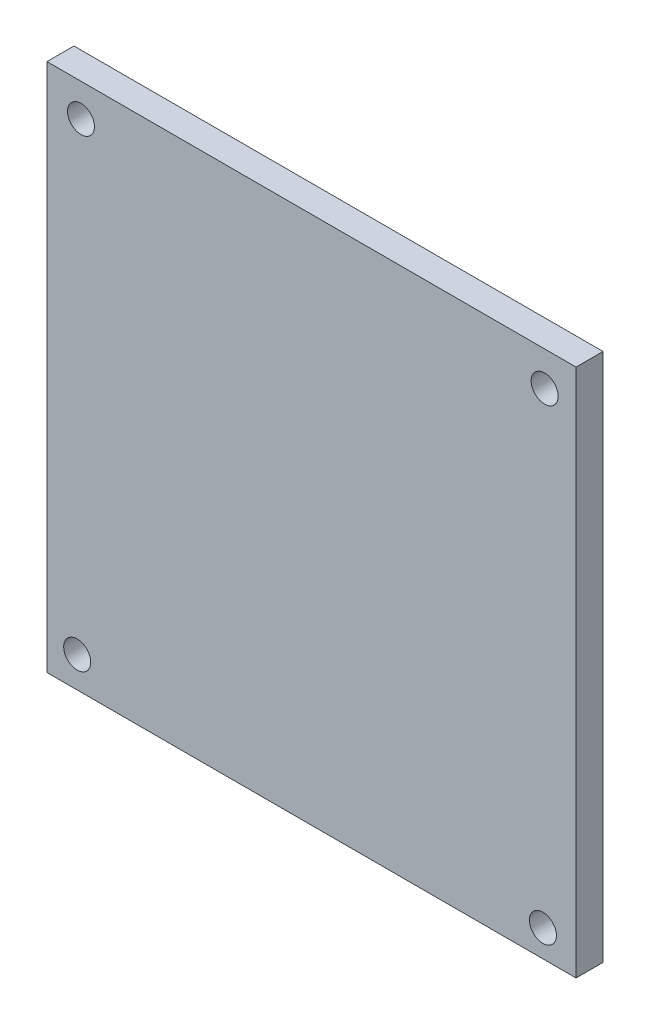
ISO-10303-21;
HEADER;
FILE_DESCRIPTION(('STEP AP214'),'2;1');
FILE_NAME('part.step','',(''),(''),'','','');
FILE_SCHEMA(('AUTOMOTIVE_DESIGN { 1 0 10303 214 1 1 1 1 }'));
ENDSEC;
DATA;
#1=APPLICATION_CONTEXT('core data for automotive mechanical design processes');
#2=APPLICATION_PROTOCOL_DEFINITION('international standard','automotive_design',2000,#1);
#3=PRODUCT_CONTEXT('',#1,'mechanical');
#4=PRODUCT('Part','Part','',(#3));
#5=PRODUCT_RELATED_PRODUCT_CATEGORY('part','',(#4));
#6=PRODUCT_DEFINITION_FORMATION('','',#4);
#7=PRODUCT_DEFINITION_CONTEXT('part definition',#1,'design');
#8=PRODUCT_DEFINITION('design','',#6,#7);
#9=PRODUCT_DEFINITION_SHAPE('','',#8);
#10=(LENGTH_UNIT() NAMED_UNIT(*) SI_UNIT(.MILLI.,.METRE.));
#11=(NAMED_UNIT(*) PLANE_ANGLE_UNIT() SI_UNIT($,.RADIAN.));
#12=(NAMED_UNIT(*) SI_UNIT($,.STERADIAN.) SOLID_ANGLE_UNIT());
#13=UNCERTAINTY_MEASURE_WITH_UNIT(LENGTH_MEASURE(1.E-05),#10,'distance_accuracy_value','');
#14=(GEOMETRIC_REPRESENTATION_CONTEXT(3) GLOBAL_UNCERTAINTY_ASSIGNED_CONTEXT((#13)) GLOBAL_UNIT_ASSIGNED_CONTEXT((#10,
#11,#12)) REPRESENTATION_CONTEXT('',''));
#15=CARTESIAN_POINT('',(0.,0.,0.));
#16=DIRECTION('',(0.,0.,1.));
#17=DIRECTION('',(1.,0.,0.));
#18=AXIS2_PLACEMENT_3D('',#15,#16,#17);
#19=CARTESIAN_POINT('',(-24.892,24.892,2.54));
#20=DIRECTION('',(1.,0.,0.));
#21=DIRECTION('',(0.,1.,0.));
#22=AXIS2_PLACEMENT_3D('',#19,#20,#21);
#23=PLANE('',#22);
#24=DIRECTION('',(0.,-1.,0.));
#25=VECTOR('',#24,1.);
#26=CARTESIAN_POINT('',(-24.892,24.892,0.));
#27=LINE('',#26,#25);
#28=CARTESIAN_POINT('',(-24.892,24.892,0.));
#29=VERTEX_POINT('',#28);
#30=CARTESIAN_POINT('',(-24.892,-24.892,0.));
#31=VERTEX_POINT('',#30);
#32=EDGE_CURVE('E98',#29,#31,#27,.T.);
#33=ORIENTED_EDGE('',*,*,#32,.T.);
#34=DIRECTION('',(0.,0.,-1.));
#35=VECTOR('',#34,1.);
#36=CARTESIAN_POINT('',(-24.892,-24.892,2.54));
#37=LINE('',#36,#35);
#38=CARTESIAN_POINT('',(-24.892,-24.892,2.54));
#39=VERTEX_POINT('',#38);
#40=EDGE_CURVE('E11',#39,#31,#37,.T.);
#41=ORIENTED_EDGE('',*,*,#40,.F.);
#42=DIRECTION('',(0.,-1.,0.));
#43=VECTOR('',#42,1.);
#44=CARTESIAN_POINT('',(-24.892,24.892,2.54));
#45=LINE('',#44,#43);
#46=CARTESIAN_POINT('',(-24.892,24.892,2.54));
#47=VERTEX_POINT('',#46);
#48=EDGE_CURVE('E86',#47,#39,#45,.T.);
#49=ORIENTED_EDGE('',*,*,#48,.F.);
#50=DIRECTION('',(0.,0.,-1.));
#51=VECTOR('',#50,1.);
#52=CARTESIAN_POINT('',(-24.892,24.892,2.54));
#53=LINE('',#52,#51);
#54=EDGE_CURVE('E94',#47,#29,#53,.T.);
#55=ORIENTED_EDGE('',*,*,#54,.T.);
#56=EDGE_LOOP('',(#33,#41,#49,#55));
#57=FACE_BOUND('',#56,.T.);
#58=ADVANCED_FACE('F35',(#57),#23,.F.);
#59=CARTESIAN_POINT('',(24.892,-24.892,2.54));
#60=DIRECTION('',(0.,1.,0.));
#61=DIRECTION('',(-1.,0.,0.));
#62=AXIS2_PLACEMENT_3D('',#59,#60,#61);
#63=PLANE('',#62);
#64=DIRECTION('',(1.,0.,0.));
#65=VECTOR('',#64,1.);
#66=CARTESIAN_POINT('',(24.892,-24.892,0.));
#67=LINE('',#66,#65);
#68=CARTESIAN_POINT('',(24.892,-24.892,0.));
#69=VERTEX_POINT('',#68);
#70=EDGE_CURVE('E90',#31,#69,#67,.T.);
#71=ORIENTED_EDGE('',*,*,#70,.T.);
#72=DIRECTION('',(0.,0.,-1.));
#73=VECTOR('',#72,1.);
#74=CARTESIAN_POINT('',(24.892,-24.892,2.54));
#75=LINE('',#74,#73);
#76=CARTESIAN_POINT('',(24.892,-24.892,2.54));
#77=VERTEX_POINT('',#76);
#78=EDGE_CURVE('E43',#77,#69,#75,.T.);
#79=ORIENTED_EDGE('',*,*,#78,.F.);
#80=DIRECTION('',(1.,0.,0.));
#81=VECTOR('',#80,1.);
#82=CARTESIAN_POINT('',(24.892,-24.892,2.54));
#83=LINE('',#82,#81);
#84=EDGE_CURVE('E81',#39,#77,#83,.T.);
#85=ORIENTED_EDGE('',*,*,#84,.F.);
#86=ORIENTED_EDGE('',*,*,#40,.T.);
#87=EDGE_LOOP('',(#71,#79,#85,#86));
#88=FACE_BOUND('',#87,.T.);
#89=ADVANCED_FACE('F89',(#88),#63,.F.);
#90=CARTESIAN_POINT('',(24.892,24.892,2.54));
#91=DIRECTION('',(-1.,0.,0.));
#92=DIRECTION('',(0.,-1.,0.));
#93=AXIS2_PLACEMENT_3D('',#90,#91,#92);
#94=PLANE('',#93);
#95=DIRECTION('',(0.,1.,0.));
#96=VECTOR('',#95,1.);
#97=CARTESIAN_POINT('',(24.892,24.892,0.));
#98=LINE('',#97,#96);
#99=CARTESIAN_POINT('',(24.892,24.892,0.));
#100=VERTEX_POINT('',#99);
#101=EDGE_CURVE('E68',#69,#100,#98,.T.);
#102=ORIENTED_EDGE('',*,*,#101,.T.);
#103=DIRECTION('',(0.,0.,-1.));
#104=VECTOR('',#103,1.);
#105=CARTESIAN_POINT('',(24.892,24.892,2.54));
#106=LINE('',#105,#104);
#107=CARTESIAN_POINT('',(24.892,24.892,2.54));
#108=VERTEX_POINT('',#107);
#109=EDGE_CURVE('E91',#108,#100,#106,.T.);
#110=ORIENTED_EDGE('',*,*,#109,.F.);
#111=DIRECTION('',(0.,1.,0.));
#112=VECTOR('',#111,1.);
#113=CARTESIAN_POINT('',(24.892,24.892,2.54));
#114=LINE('',#113,#112);
#115=EDGE_CURVE('E84',#77,#108,#114,.T.);
#116=ORIENTED_EDGE('',*,*,#115,.F.);
#117=ORIENTED_EDGE('',*,*,#78,.T.);
#118=EDGE_LOOP('',(#102,#110,#116,#117));
#119=FACE_BOUND('',#118,.T.);
#120=ADVANCED_FACE('F92',(#119),#94,.F.);
#121=CARTESIAN_POINT('',(24.892,24.892,2.54));
#122=DIRECTION('',(0.,-1.,0.));
#123=DIRECTION('',(1.,0.,0.));
#124=AXIS2_PLACEMENT_3D('',#121,#122,#123);
#125=PLANE('',#124);
#126=DIRECTION('',(-1.,0.,0.));
#127=VECTOR('',#126,1.);
#128=CARTESIAN_POINT('',(24.892,24.892,0.));
#129=LINE('',#128,#127);
#130=EDGE_CURVE('E74',#100,#29,#129,.T.);
#131=ORIENTED_EDGE('',*,*,#130,.T.);
#132=ORIENTED_EDGE('',*,*,#54,.F.);
#133=DIRECTION('',(-1.,0.,0.));
#134=VECTOR('',#133,1.);
#135=CARTESIAN_POINT('',(24.892,24.892,2.54));
#136=LINE('',#135,#134);
#137=EDGE_CURVE('E51',#108,#47,#136,.T.);
#138=ORIENTED_EDGE('',*,*,#137,.F.);
#139=ORIENTED_EDGE('',*,*,#109,.T.);
#140=EDGE_LOOP('',(#131,#132,#138,#139));
#141=FACE_BOUND('',#140,.T.);
#142=ADVANCED_FACE('F106',(#141),#125,.F.);
#143=CARTESIAN_POINT('',(0.,0.,2.54));
#144=DIRECTION('',(0.,0.,-1.));
#145=DIRECTION('',(-1.,0.,0.));
#146=AXIS2_PLACEMENT_3D('',#143,#144,#145);
#147=PLANE('',#146);
#148=CARTESIAN_POINT('',(21.9344728088941,21.6613431472842,2.54));
#149=DIRECTION('',(0.,0.,1.));
#150=DIRECTION('',(1.,0.,0.));
#151=AXIS2_PLACEMENT_3D('',#148,#149,#150);
#152=CIRCLE('',#151,1.27);
#153=CARTESIAN_POINT('',(23.2044728088941,21.6613431472842,2.54));
#154=VERTEX_POINT('',#153);
#155=EDGE_CURVE('E130',#154,#154,#152,.T.);
#156=ORIENTED_EDGE('',*,*,#155,.F.);
#157=EDGE_LOOP('',(#156));
#158=FACE_BOUND('',#157,.T.);
#159=CARTESIAN_POINT('',(21.7749818454122,-22.3624127682645,2.54));
#160=DIRECTION('',(0.,0.,1.));
#161=DIRECTION('',(1.,0.,0.));
#162=AXIS2_PLACEMENT_3D('',#159,#160,#161);
#163=CIRCLE('',#162,1.27);
#164=CARTESIAN_POINT('',(23.0449818454122,-22.3624127682645,2.54));
#165=VERTEX_POINT('',#164);
#166=EDGE_CURVE('E124',#165,#165,#163,.T.);
#167=ORIENTED_EDGE('',*,*,#166,.F.);
#168=EDGE_LOOP('',(#167));
#169=FACE_BOUND('',#168,.T.);
#170=CARTESIAN_POINT('',(-22.0472000000003,-22.0037119074315,2.54));
#171=DIRECTION('',(0.,0.,1.));
#172=DIRECTION('',(1.,0.,0.));
#173=AXIS2_PLACEMENT_3D('',#170,#171,#172);
#174=CIRCLE('',#173,1.27);
#175=CARTESIAN_POINT('',(-20.7772000000003,-22.0037119074315,2.54));
#176=VERTEX_POINT('',#175);
#177=EDGE_CURVE('E118',#176,#176,#174,.T.);
#178=ORIENTED_EDGE('',*,*,#177,.F.);
#179=EDGE_LOOP('',(#178));
#180=FACE_BOUND('',#179,.T.);
#181=CARTESIAN_POINT('',(-21.6884991391673,21.8184699379818,2.54));
#182=DIRECTION('',(0.,0.,1.));
#183=DIRECTION('',(1.,0.,0.));
#184=AXIS2_PLACEMENT_3D('',#181,#182,#183);
#185=CIRCLE('',#184,1.27);
#186=CARTESIAN_POINT('',(-20.4184991391673,21.8184699379818,2.54));
#187=VERTEX_POINT('',#186);
#188=EDGE_CURVE('E112',#187,#187,#185,.T.);
#189=ORIENTED_EDGE('',*,*,#188,.F.);
#190=EDGE_LOOP('',(#189));
#191=FACE_BOUND('',#190,.T.);
#192=ORIENTED_EDGE('',*,*,#48,.T.);
#193=ORIENTED_EDGE('',*,*,#84,.T.);
#194=ORIENTED_EDGE('',*,*,#115,.T.);
#195=ORIENTED_EDGE('',*,*,#137,.T.);
#196=EDGE_LOOP('',(#192,#193,#194,#195));
#197=FACE_BOUND('',#196,.T.);
#198=ADVANCED_FACE('F82',(#158,#169,#180,#191,#197),#147,.F.);
#199=CARTESIAN_POINT('',(0.,0.,0.));
#200=DIRECTION('',(0.,0.,-1.));
#201=DIRECTION('',(-1.,0.,0.));
#202=AXIS2_PLACEMENT_3D('',#199,#200,#201);
#203=PLANE('',#202);
#204=CARTESIAN_POINT('',(21.9344728088941,21.6613431472842,0.));
#205=DIRECTION('',(0.,0.,1.));
#206=DIRECTION('',(1.,0.,0.));
#207=AXIS2_PLACEMENT_3D('',#204,#205,#206);
#208=CIRCLE('',#207,1.27);
#209=CARTESIAN_POINT('',(23.2044728088941,21.6613431472842,0.));
#210=VERTEX_POINT('',#209);
#211=EDGE_CURVE('E127',#210,#210,#208,.T.);
#212=ORIENTED_EDGE('',*,*,#211,.T.);
#213=EDGE_LOOP('',(#212));
#214=FACE_BOUND('',#213,.T.);
#215=CARTESIAN_POINT('',(21.7749818454122,-22.3624127682645,0.));
#216=DIRECTION('',(0.,0.,1.));
#217=DIRECTION('',(1.,0.,0.));
#218=AXIS2_PLACEMENT_3D('',#215,#216,#217);
#219=CIRCLE('',#218,1.27);
#220=CARTESIAN_POINT('',(23.0449818454122,-22.3624127682645,0.));
#221=VERTEX_POINT('',#220);
#222=EDGE_CURVE('E121',#221,#221,#219,.T.);
#223=ORIENTED_EDGE('',*,*,#222,.T.);
#224=EDGE_LOOP('',(#223));
#225=FACE_BOUND('',#224,.T.);
#226=CARTESIAN_POINT('',(-22.0472000000003,-22.0037119074315,0.));
#227=DIRECTION('',(0.,0.,1.));
#228=DIRECTION('',(1.,0.,0.));
#229=AXIS2_PLACEMENT_3D('',#226,#227,#228);
#230=CIRCLE('',#229,1.27);
#231=CARTESIAN_POINT('',(-20.7772000000003,-22.0037119074315,0.));
#232=VERTEX_POINT('',#231);
#233=EDGE_CURVE('E115',#232,#232,#230,.T.);
#234=ORIENTED_EDGE('',*,*,#233,.T.);
#235=EDGE_LOOP('',(#234));
#236=FACE_BOUND('',#235,.T.);
#237=CARTESIAN_POINT('',(-21.6884991391673,21.8184699379818,0.));
#238=DIRECTION('',(0.,0.,1.));
#239=DIRECTION('',(1.,0.,0.));
#240=AXIS2_PLACEMENT_3D('',#237,#238,#239);
#241=CIRCLE('',#240,1.27);
#242=CARTESIAN_POINT('',(-20.4184991391673,21.8184699379818,0.));
#243=VERTEX_POINT('',#242);
#244=EDGE_CURVE('E101',#243,#243,#241,.T.);
#245=ORIENTED_EDGE('',*,*,#244,.T.);
#246=EDGE_LOOP('',(#245));
#247=FACE_BOUND('',#246,.T.);
#248=ORIENTED_EDGE('',*,*,#32,.F.);
#249=ORIENTED_EDGE('',*,*,#130,.F.);
#250=ORIENTED_EDGE('',*,*,#101,.F.);
#251=ORIENTED_EDGE('',*,*,#70,.F.);
#252=EDGE_LOOP('',(#248,#249,#250,#251));
#253=FACE_BOUND('',#252,.T.);
#254=ADVANCED_FACE('F109',(#214,#225,#236,#247,#253),#203,.T.);
#255=CARTESIAN_POINT('',(-21.6884991391673,21.8184699379818,0.));
#256=DIRECTION('',(0.,0.,1.));
#257=DIRECTION('',(1.,0.,0.));
#258=AXIS2_PLACEMENT_3D('',#255,#256,#257);
#259=CYLINDRICAL_SURFACE('',#258,1.27);
#260=ORIENTED_EDGE('',*,*,#244,.F.);
#261=EDGE_LOOP('',(#260));
#262=FACE_BOUND('',#261,.T.);
#263=ORIENTED_EDGE('',*,*,#188,.T.);
#264=EDGE_LOOP('',(#263));
#265=FACE_BOUND('',#264,.T.);
#266=ADVANCED_FACE('F154',(#262,#265),#259,.F.);
#267=CARTESIAN_POINT('',(-22.0472000000003,-22.0037119074315,0.));
#268=DIRECTION('',(0.,0.,1.));
#269=DIRECTION('',(1.,0.,0.));
#270=AXIS2_PLACEMENT_3D('',#267,#268,#269);
#271=CYLINDRICAL_SURFACE('',#270,1.27);
#272=ORIENTED_EDGE('',*,*,#233,.F.);
#273=EDGE_LOOP('',(#272));
#274=FACE_BOUND('',#273,.T.);
#275=ORIENTED_EDGE('',*,*,#177,.T.);
#276=EDGE_LOOP('',(#275));
#277=FACE_BOUND('',#276,.T.);
#278=ADVANCED_FACE('F156',(#274,#277),#271,.F.);
#279=CARTESIAN_POINT('',(21.7749818454122,-22.3624127682645,0.));
#280=DIRECTION('',(0.,0.,1.));
#281=DIRECTION('',(1.,0.,0.));
#282=AXIS2_PLACEMENT_3D('',#279,#280,#281);
#283=CYLINDRICAL_SURFACE('',#282,1.27);
#284=ORIENTED_EDGE('',*,*,#222,.F.);
#285=EDGE_LOOP('',(#284));
#286=FACE_BOUND('',#285,.T.);
#287=ORIENTED_EDGE('',*,*,#166,.T.);
#288=EDGE_LOOP('',(#287));
#289=FACE_BOUND('',#288,.T.);
#290=ADVANCED_FACE('F141',(#286,#289),#283,.F.);
#291=CARTESIAN_POINT('',(21.9344728088941,21.6613431472842,0.));
#292=DIRECTION('',(0.,0.,1.));
#293=DIRECTION('',(1.,0.,0.));
#294=AXIS2_PLACEMENT_3D('',#291,#292,#293);
#295=CYLINDRICAL_SURFACE('',#294,1.27);
#296=ORIENTED_EDGE('',*,*,#211,.F.);
#297=EDGE_LOOP('',(#296));
#298=FACE_BOUND('',#297,.T.);
#299=ORIENTED_EDGE('',*,*,#155,.T.);
#300=EDGE_LOOP('',(#299));
#301=FACE_BOUND('',#300,.T.);
#302=ADVANCED_FACE('F138',(#298,#301),#295,.F.);
#303=CLOSED_SHELL('',(#58,#89,#120,#142,#198,#254,#266,#278,#290,#302));
#304=MANIFOLD_SOLID_BREP('B2',#303);
#305=ADVANCED_BREP_SHAPE_REPRESENTATION('',(#18,#304),#14);
#306=SHAPE_DEFINITION_REPRESENTATION(#9,#305);
ENDSEC;
END-ISO-10303-21;
